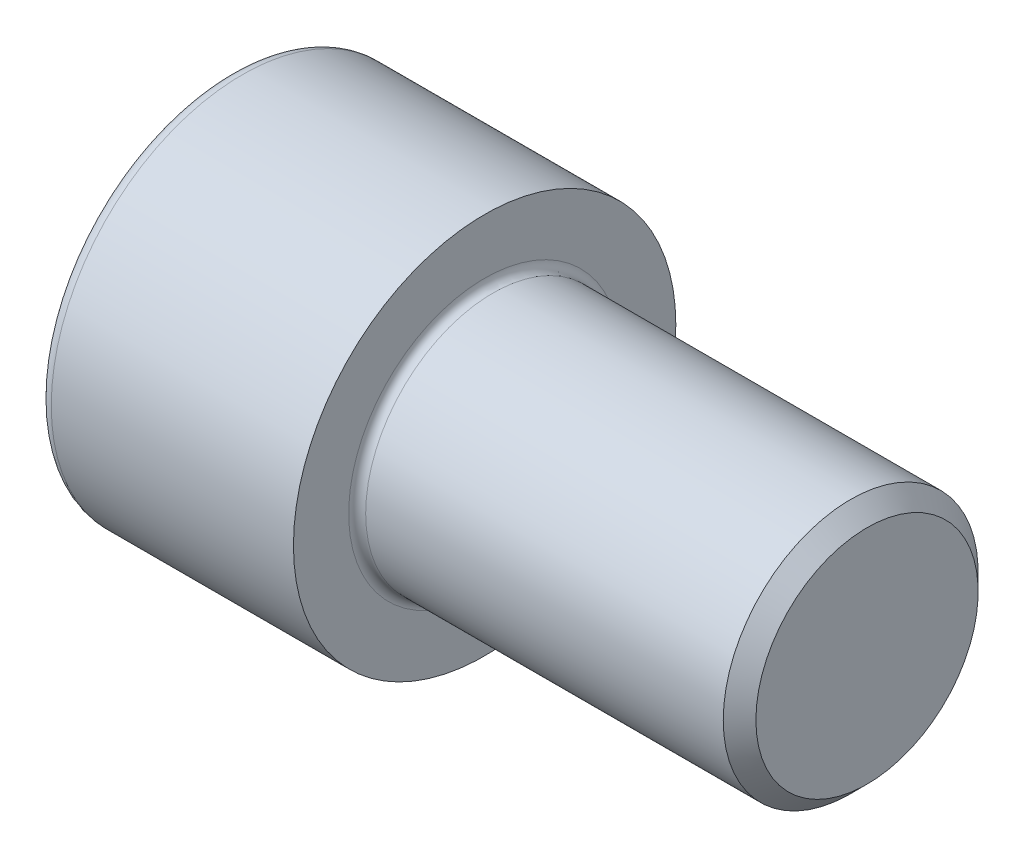
ISO-10303-21;
HEADER;
FILE_DESCRIPTION(('STEP AP214'),'2;1');
FILE_NAME('part.step','',(''),(''),'','','');
FILE_SCHEMA(('AUTOMOTIVE_DESIGN { 1 0 10303 214 1 1 1 1 }'));
ENDSEC;
DATA;
#1=APPLICATION_CONTEXT('core data for automotive mechanical design processes');
#2=APPLICATION_PROTOCOL_DEFINITION('international standard','automotive_design',2000,#1);
#3=PRODUCT_CONTEXT('',#1,'mechanical');
#4=PRODUCT('Part','Part','',(#3));
#5=PRODUCT_RELATED_PRODUCT_CATEGORY('part','',(#4));
#6=PRODUCT_DEFINITION_FORMATION('','',#4);
#7=PRODUCT_DEFINITION_CONTEXT('part definition',#1,'design');
#8=PRODUCT_DEFINITION('design','',#6,#7);
#9=PRODUCT_DEFINITION_SHAPE('','',#8);
#10=(LENGTH_UNIT() NAMED_UNIT(*) SI_UNIT(.MILLI.,.METRE.));
#11=(NAMED_UNIT(*) PLANE_ANGLE_UNIT() SI_UNIT($,.RADIAN.));
#12=(NAMED_UNIT(*) SI_UNIT($,.STERADIAN.) SOLID_ANGLE_UNIT());
#13=UNCERTAINTY_MEASURE_WITH_UNIT(LENGTH_MEASURE(1.E-05),#10,'distance_accuracy_value','');
#14=(GEOMETRIC_REPRESENTATION_CONTEXT(3) GLOBAL_UNCERTAINTY_ASSIGNED_CONTEXT((#13)) GLOBAL_UNIT_ASSIGNED_CONTEXT((#10,
#11,#12)) REPRESENTATION_CONTEXT('',''));
#15=CARTESIAN_POINT('',(0.,0.,0.));
#16=DIRECTION('',(0.,0.,1.));
#17=DIRECTION('',(1.,0.,0.));
#18=AXIS2_PLACEMENT_3D('',#15,#16,#17);
#19=CARTESIAN_POINT('',(0.,0.,0.));
#20=DIRECTION('',(-1.,0.,0.));
#21=DIRECTION('',(0.,0.,1.));
#22=AXIS2_PLACEMENT_3D('',#19,#20,#21);
#23=PLANE('',#22);
#24=DIRECTION('',(0.,-0.499999999999999,0.866025403784439));
#25=VECTOR('',#24,1.);
#26=CARTESIAN_POINT('',(0.,12.8604772461989,0.));
#27=LINE('',#26,#25);
#28=CARTESIAN_POINT('',(0.,12.8604772461989,0.));
#29=VERTEX_POINT('',#28);
#30=CARTESIAN_POINT('',(0.,6.43023862309947,11.1375));
#31=VERTEX_POINT('',#30);
#32=EDGE_CURVE('E259',#29,#31,#27,.T.);
#33=ORIENTED_EDGE('',*,*,#32,.T.);
#34=DIRECTION('',(0.,1.,0.));
#35=VECTOR('',#34,1.);
#36=CARTESIAN_POINT('',(0.,-6.43023862309945,11.1375));
#37=LINE('',#36,#35);
#38=CARTESIAN_POINT('',(0.,-6.43023862309945,11.1375));
#39=VERTEX_POINT('',#38);
#40=EDGE_CURVE('E131',#39,#31,#37,.T.);
#41=ORIENTED_EDGE('',*,*,#40,.F.);
#42=DIRECTION('',(0.,-0.500000000000001,-0.866025403784438));
#43=VECTOR('',#42,1.);
#44=CARTESIAN_POINT('',(0.,-6.43023862309945,11.1375));
#45=LINE('',#44,#43);
#46=CARTESIAN_POINT('',(0.,-12.8604772461989,0.));
#47=VERTEX_POINT('',#46);
#48=EDGE_CURVE('E262',#39,#47,#45,.T.);
#49=ORIENTED_EDGE('',*,*,#48,.T.);
#50=DIRECTION('',(0.,0.499999999999999,-0.866025403784439));
#51=VECTOR('',#50,1.);
#52=CARTESIAN_POINT('',(0.,-12.8604772461989,0.));
#53=LINE('',#52,#51);
#54=CARTESIAN_POINT('',(0.,-6.43023862309948,-11.1375));
#55=VERTEX_POINT('',#54);
#56=EDGE_CURVE('E265',#47,#55,#53,.T.);
#57=ORIENTED_EDGE('',*,*,#56,.T.);
#58=DIRECTION('',(0.,-1.,0.));
#59=VECTOR('',#58,1.);
#60=CARTESIAN_POINT('',(0.,6.43023862309944,-11.1375));
#61=LINE('',#60,#59);
#62=CARTESIAN_POINT('',(0.,6.43023862309944,-11.1375));
#63=VERTEX_POINT('',#62);
#64=EDGE_CURVE('E268',#63,#55,#61,.T.);
#65=ORIENTED_EDGE('',*,*,#64,.F.);
#66=DIRECTION('',(0.,-0.500000000000001,-0.866025403784438));
#67=VECTOR('',#66,1.);
#68=CARTESIAN_POINT('',(0.,12.8604772461989,0.));
#69=LINE('',#68,#67);
#70=EDGE_CURVE('E126',#29,#63,#69,.T.);
#71=ORIENTED_EDGE('',*,*,#70,.F.);
#72=EDGE_LOOP('',(#33,#41,#49,#57,#65,#71));
#73=FACE_BOUND('',#72,.T.);
#74=CARTESIAN_POINT('',(0.,0.,0.));
#75=DIRECTION('',(-1.,0.,0.));
#76=DIRECTION('',(0.,0.,1.));
#77=AXIS2_PLACEMENT_3D('',#74,#75,#76);
#78=CIRCLE('',#77,21.);
#79=CARTESIAN_POINT('',(0.,0.,21.));
#80=VERTEX_POINT('',#79);
#81=EDGE_CURVE('E43',#80,#80,#78,.T.);
#82=ORIENTED_EDGE('',*,*,#81,.T.);
#83=EDGE_LOOP('',(#82));
#84=FACE_BOUND('',#83,.T.);
#85=ADVANCED_FACE('F35',(#73,#84),#23,.T.);
#86=CARTESIAN_POINT('',(-31.75,0.,0.));
#87=DIRECTION('',(-1.,0.,0.));
#88=DIRECTION('',(0.,0.,1.));
#89=AXIS2_PLACEMENT_3D('',#86,#87,#88);
#90=CYLINDRICAL_SURFACE('',#89,22.5);
#91=CARTESIAN_POINT('',(1.5,0.,0.));
#92=DIRECTION('',(-1.,0.,0.));
#93=DIRECTION('',(0.,0.,1.));
#94=AXIS2_PLACEMENT_3D('',#91,#92,#93);
#95=CIRCLE('',#94,22.5);
#96=CARTESIAN_POINT('',(1.5,0.,22.5));
#97=VERTEX_POINT('',#96);
#98=EDGE_CURVE('E11',#97,#97,#95,.F.);
#99=ORIENTED_EDGE('',*,*,#98,.T.);
#100=EDGE_LOOP('',(#99));
#101=FACE_BOUND('',#100,.T.);
#102=CARTESIAN_POINT('',(30.,0.,0.));
#103=DIRECTION('',(-1.,0.,0.));
#104=DIRECTION('',(0.,0.,1.));
#105=AXIS2_PLACEMENT_3D('',#102,#103,#104);
#106=CIRCLE('',#105,22.5);
#107=CARTESIAN_POINT('',(30.,0.,22.5));
#108=VERTEX_POINT('',#107);
#109=EDGE_CURVE('E149',#108,#108,#106,.T.);
#110=ORIENTED_EDGE('',*,*,#109,.T.);
#111=EDGE_LOOP('',(#110));
#112=FACE_BOUND('',#111,.T.);
#113=ADVANCED_FACE('F173',(#101,#112),#90,.T.);
#114=CARTESIAN_POINT('',(30.,22.5,0.));
#115=DIRECTION('',(1.,0.,0.));
#116=DIRECTION('',(0.,0.,-1.));
#117=AXIS2_PLACEMENT_3D('',#114,#115,#116);
#118=PLANE('',#117);
#119=CARTESIAN_POINT('',(30.,0.,0.));
#120=DIRECTION('',(1.,0.,0.));
#121=DIRECTION('',(0.,0.,-1.));
#122=AXIS2_PLACEMENT_3D('',#119,#120,#121);
#123=CIRCLE('',#122,15.9999999999999);
#124=CARTESIAN_POINT('',(30.,0.,-15.9999999999999));
#125=VERTEX_POINT('',#124);
#126=EDGE_CURVE('E152',#125,#125,#123,.F.);
#127=ORIENTED_EDGE('',*,*,#126,.T.);
#128=EDGE_LOOP('',(#127));
#129=FACE_BOUND('',#128,.T.);
#130=ORIENTED_EDGE('',*,*,#109,.F.);
#131=EDGE_LOOP('',(#130));
#132=FACE_BOUND('',#131,.T.);
#133=ADVANCED_FACE('F179',(#129,#132),#118,.T.);
#134=CARTESIAN_POINT('',(-31.75,0.,0.));
#135=DIRECTION('',(-1.,0.,0.));
#136=DIRECTION('',(0.,0.,1.));
#137=AXIS2_PLACEMENT_3D('',#134,#135,#136);
#138=CYLINDRICAL_SURFACE('',#137,14.9999999999999);
#139=CARTESIAN_POINT('',(31.,0.,0.));
#140=DIRECTION('',(1.,0.,0.));
#141=DIRECTION('',(0.,0.,-1.));
#142=AXIS2_PLACEMENT_3D('',#139,#140,#141);
#143=CIRCLE('',#142,14.9999999999999);
#144=CARTESIAN_POINT('',(31.,0.,-14.9999999999999));
#145=VERTEX_POINT('',#144);
#146=EDGE_CURVE('E155',#145,#145,#143,.T.);
#147=ORIENTED_EDGE('',*,*,#146,.T.);
#148=EDGE_LOOP('',(#147));
#149=FACE_BOUND('',#148,.T.);
#150=CARTESIAN_POINT('',(73.0789999999998,0.,0.));
#151=DIRECTION('',(-1.,0.,0.));
#152=DIRECTION('',(0.,0.,1.));
#153=AXIS2_PLACEMENT_3D('',#150,#151,#152);
#154=CIRCLE('',#153,14.9999999999998);
#155=CARTESIAN_POINT('',(73.0789999999998,0.,14.9999999999998));
#156=VERTEX_POINT('',#155);
#157=EDGE_CURVE('E146',#156,#156,#154,.T.);
#158=ORIENTED_EDGE('',*,*,#157,.T.);
#159=EDGE_LOOP('',(#158));
#160=FACE_BOUND('',#159,.T.);
#161=ADVANCED_FACE('F185',(#149,#160),#138,.T.);
#162=CARTESIAN_POINT('',(75.,0.,0.));
#163=DIRECTION('',(-1.,0.,0.));
#164=DIRECTION('',(0.,0.,1.));
#165=AXIS2_PLACEMENT_3D('',#162,#163,#164);
#166=CONICAL_SURFACE('',#165,13.079,0.785398163397344);
#167=ORIENTED_EDGE('',*,*,#157,.F.);
#168=EDGE_LOOP('',(#167));
#169=FACE_BOUND('',#168,.T.);
#170=CARTESIAN_POINT('',(75.,0.,0.));
#171=DIRECTION('',(-1.,0.,0.));
#172=DIRECTION('',(0.,0.,1.));
#173=AXIS2_PLACEMENT_3D('',#170,#171,#172);
#174=CIRCLE('',#173,13.079);
#175=CARTESIAN_POINT('',(75.,0.,13.079));
#176=VERTEX_POINT('',#175);
#177=EDGE_CURVE('E142',#176,#176,#174,.T.);
#178=ORIENTED_EDGE('',*,*,#177,.T.);
#179=EDGE_LOOP('',(#178));
#180=FACE_BOUND('',#179,.T.);
#181=ADVANCED_FACE('F189',(#169,#180),#166,.T.);
#182=CARTESIAN_POINT('',(75.,13.079,0.));
#183=DIRECTION('',(1.,0.,0.));
#184=DIRECTION('',(0.,0.,-1.));
#185=AXIS2_PLACEMENT_3D('',#182,#183,#184);
#186=PLANE('',#185);
#187=ORIENTED_EDGE('',*,*,#177,.F.);
#188=EDGE_LOOP('',(#187));
#189=FACE_BOUND('',#188,.T.);
#190=ADVANCED_FACE('F169',(#189),#186,.T.);
#191=CARTESIAN_POINT('',(31.,0.,0.));
#192=DIRECTION('',(1.,0.,0.));
#193=DIRECTION('',(0.,0.,-1.));
#194=AXIS2_PLACEMENT_3D('',#191,#192,#193);
#195=TOROIDAL_SURFACE('',#194,15.9999999999999,1.);
#196=ORIENTED_EDGE('',*,*,#146,.F.);
#197=EDGE_LOOP('',(#196));
#198=FACE_BOUND('',#197,.T.);
#199=ORIENTED_EDGE('',*,*,#126,.F.);
#200=EDGE_LOOP('',(#199));
#201=FACE_BOUND('',#200,.T.);
#202=ADVANCED_FACE('F162',(#198,#201),#195,.F.);
#203=CARTESIAN_POINT('',(1.5,0.,0.));
#204=DIRECTION('',(-1.,0.,0.));
#205=DIRECTION('',(0.,0.,1.));
#206=AXIS2_PLACEMENT_3D('',#203,#204,#205);
#207=TOROIDAL_SURFACE('',#206,21.,1.5);
#208=ORIENTED_EDGE('',*,*,#98,.F.);
#209=EDGE_LOOP('',(#208));
#210=FACE_BOUND('',#209,.T.);
#211=ORIENTED_EDGE('',*,*,#81,.F.);
#212=EDGE_LOOP('',(#211));
#213=FACE_BOUND('',#212,.T.);
#214=ADVANCED_FACE('F37',(#210,#213),#207,.T.);
#215=CARTESIAN_POINT('',(15.5,12.8604772461989,0.));
#216=DIRECTION('',(0.,-0.866025403784439,-0.499999999999999));
#217=DIRECTION('',(0.,0.499999999999999,-0.866025403784439));
#218=AXIS2_PLACEMENT_3D('',#215,#216,#217);
#219=PLANE('',#218);
#220=ORIENTED_EDGE('',*,*,#32,.F.);
#221=DIRECTION('',(-1.,0.,0.));
#222=VECTOR('',#221,1.);
#223=CARTESIAN_POINT('',(15.5,12.8604772461989,0.));
#224=LINE('',#223,#222);
#225=CARTESIAN_POINT('',(15.5,12.8604772461989,0.));
#226=VERTEX_POINT('',#225);
#227=EDGE_CURVE('E249',#226,#29,#224,.T.);
#228=ORIENTED_EDGE('',*,*,#227,.F.);
#229=DIRECTION('',(0.,-0.499999999999999,0.866025403784439));
#230=VECTOR('',#229,1.);
#231=CARTESIAN_POINT('',(15.5,12.8604772461989,0.));
#232=LINE('',#231,#230);
#233=CARTESIAN_POINT('',(15.5,9.64535793464919,5.56874999999999));
#234=VERTEX_POINT('',#233);
#235=EDGE_CURVE('E118',#226,#234,#232,.T.);
#236=ORIENTED_EDGE('',*,*,#235,.T.);
#237=CARTESIAN_POINT('',(15.5,6.43023862309947,11.1375));
#238=VERTEX_POINT('',#237);
#239=EDGE_CURVE('E109',#234,#238,#232,.T.);
#240=ORIENTED_EDGE('',*,*,#239,.T.);
#241=DIRECTION('',(-1.,0.,0.));
#242=VECTOR('',#241,1.);
#243=CARTESIAN_POINT('',(15.5,6.43023862309947,11.1375));
#244=LINE('',#243,#242);
#245=EDGE_CURVE('E123',#238,#31,#244,.T.);
#246=ORIENTED_EDGE('',*,*,#245,.T.);
#247=EDGE_LOOP('',(#220,#228,#236,#240,#246));
#248=FACE_BOUND('',#247,.T.);
#249=ADVANCED_FACE('F122',(#248),#219,.T.);
#250=CARTESIAN_POINT('',(15.5,-6.43023862309945,11.1375));
#251=DIRECTION('',(0.,0.,1.));
#252=DIRECTION('',(0.,-1.,0.));
#253=AXIS2_PLACEMENT_3D('',#250,#251,#252);
#254=PLANE('',#253);
#255=ORIENTED_EDGE('',*,*,#40,.T.);
#256=ORIENTED_EDGE('',*,*,#245,.F.);
#257=DIRECTION('',(0.,1.,0.));
#258=VECTOR('',#257,1.);
#259=CARTESIAN_POINT('',(15.5,-6.43023862309945,11.1375));
#260=LINE('',#259,#258);
#261=CARTESIAN_POINT('',(15.5,0.,11.1375));
#262=VERTEX_POINT('',#261);
#263=EDGE_CURVE('E106',#262,#238,#260,.T.);
#264=ORIENTED_EDGE('',*,*,#263,.F.);
#265=CARTESIAN_POINT('',(15.5,-6.43023862309945,11.1375));
#266=VERTEX_POINT('',#265);
#267=EDGE_CURVE('E117',#266,#262,#260,.T.);
#268=ORIENTED_EDGE('',*,*,#267,.F.);
#269=DIRECTION('',(-1.,0.,0.));
#270=VECTOR('',#269,1.);
#271=CARTESIAN_POINT('',(15.5,-6.43023862309945,11.1375));
#272=LINE('',#271,#270);
#273=EDGE_CURVE('E133',#266,#39,#272,.T.);
#274=ORIENTED_EDGE('',*,*,#273,.T.);
#275=EDGE_LOOP('',(#255,#256,#264,#268,#274));
#276=FACE_BOUND('',#275,.T.);
#277=ADVANCED_FACE('F128',(#276),#254,.F.);
#278=CARTESIAN_POINT('',(15.5,-6.43023862309945,11.1375));
#279=DIRECTION('',(0.,0.866025403784438,-0.500000000000001));
#280=DIRECTION('',(0.,0.500000000000001,0.866025403784438));
#281=AXIS2_PLACEMENT_3D('',#278,#279,#280);
#282=PLANE('',#281);
#283=ORIENTED_EDGE('',*,*,#48,.F.);
#284=ORIENTED_EDGE('',*,*,#273,.F.);
#285=DIRECTION('',(0.,-0.500000000000001,-0.866025403784438));
#286=VECTOR('',#285,1.);
#287=CARTESIAN_POINT('',(15.5,-6.43023862309945,11.1375));
#288=LINE('',#287,#286);
#289=CARTESIAN_POINT('',(15.5,-9.64535793464918,5.56875000000001));
#290=VERTEX_POINT('',#289);
#291=EDGE_CURVE('E288',#266,#290,#288,.T.);
#292=ORIENTED_EDGE('',*,*,#291,.T.);
#293=CARTESIAN_POINT('',(15.5,-12.8604772461989,0.));
#294=VERTEX_POINT('',#293);
#295=EDGE_CURVE('E277',#290,#294,#288,.T.);
#296=ORIENTED_EDGE('',*,*,#295,.T.);
#297=DIRECTION('',(-1.,0.,0.));
#298=VECTOR('',#297,1.);
#299=CARTESIAN_POINT('',(15.5,-12.8604772461989,0.));
#300=LINE('',#299,#298);
#301=EDGE_CURVE('E138',#294,#47,#300,.T.);
#302=ORIENTED_EDGE('',*,*,#301,.T.);
#303=EDGE_LOOP('',(#283,#284,#292,#296,#302));
#304=FACE_BOUND('',#303,.T.);
#305=ADVANCED_FACE('F203',(#304),#282,.T.);
#306=CARTESIAN_POINT('',(15.5,-12.8604772461989,0.));
#307=DIRECTION('',(0.,0.866025403784439,0.499999999999999));
#308=DIRECTION('',(0.,-0.499999999999999,0.866025403784439));
#309=AXIS2_PLACEMENT_3D('',#306,#307,#308);
#310=PLANE('',#309);
#311=ORIENTED_EDGE('',*,*,#56,.F.);
#312=ORIENTED_EDGE('',*,*,#301,.F.);
#313=DIRECTION('',(0.,0.499999999999999,-0.866025403784439));
#314=VECTOR('',#313,1.);
#315=CARTESIAN_POINT('',(15.5,-12.8604772461989,0.));
#316=LINE('',#315,#314);
#317=CARTESIAN_POINT('',(15.5,-9.6453579346492,-5.56874999999999));
#318=VERTEX_POINT('',#317);
#319=EDGE_CURVE('E255',#294,#318,#316,.T.);
#320=ORIENTED_EDGE('',*,*,#319,.T.);
#321=CARTESIAN_POINT('',(15.5,-6.43023862309948,-11.1375));
#322=VERTEX_POINT('',#321);
#323=EDGE_CURVE('E287',#318,#322,#316,.T.);
#324=ORIENTED_EDGE('',*,*,#323,.T.);
#325=DIRECTION('',(-1.,0.,0.));
#326=VECTOR('',#325,1.);
#327=CARTESIAN_POINT('',(15.5,-6.43023862309948,-11.1375));
#328=LINE('',#327,#326);
#329=EDGE_CURVE('E248',#322,#55,#328,.T.);
#330=ORIENTED_EDGE('',*,*,#329,.T.);
#331=EDGE_LOOP('',(#311,#312,#320,#324,#330));
#332=FACE_BOUND('',#331,.T.);
#333=ADVANCED_FACE('F206',(#332),#310,.T.);
#334=CARTESIAN_POINT('',(15.5,6.43023862309944,-11.1375));
#335=DIRECTION('',(0.,0.,-1.));
#336=DIRECTION('',(0.,1.,0.));
#337=AXIS2_PLACEMENT_3D('',#334,#335,#336);
#338=PLANE('',#337);
#339=ORIENTED_EDGE('',*,*,#64,.T.);
#340=ORIENTED_EDGE('',*,*,#329,.F.);
#341=DIRECTION('',(0.,-1.,0.));
#342=VECTOR('',#341,1.);
#343=CARTESIAN_POINT('',(15.5,6.43023862309944,-11.1375));
#344=LINE('',#343,#342);
#345=CARTESIAN_POINT('',(15.5,0.,-11.1375));
#346=VERTEX_POINT('',#345);
#347=EDGE_CURVE('E252',#346,#322,#344,.T.);
#348=ORIENTED_EDGE('',*,*,#347,.F.);
#349=CARTESIAN_POINT('',(15.5,6.43023862309944,-11.1375));
#350=VERTEX_POINT('',#349);
#351=EDGE_CURVE('E50',#350,#346,#344,.T.);
#352=ORIENTED_EDGE('',*,*,#351,.F.);
#353=DIRECTION('',(-1.,0.,0.));
#354=VECTOR('',#353,1.);
#355=CARTESIAN_POINT('',(15.5,6.43023862309944,-11.1375));
#356=LINE('',#355,#354);
#357=EDGE_CURVE('E245',#350,#63,#356,.T.);
#358=ORIENTED_EDGE('',*,*,#357,.T.);
#359=EDGE_LOOP('',(#339,#340,#348,#352,#358));
#360=FACE_BOUND('',#359,.T.);
#361=ADVANCED_FACE('F210',(#360),#338,.F.);
#362=CARTESIAN_POINT('',(15.5,12.8604772461989,0.));
#363=DIRECTION('',(0.,0.866025403784438,-0.500000000000001));
#364=DIRECTION('',(0.,0.500000000000001,0.866025403784438));
#365=AXIS2_PLACEMENT_3D('',#362,#363,#364);
#366=PLANE('',#365);
#367=ORIENTED_EDGE('',*,*,#70,.T.);
#368=ORIENTED_EDGE('',*,*,#357,.F.);
#369=DIRECTION('',(0.,-0.500000000000001,-0.866025403784438));
#370=VECTOR('',#369,1.);
#371=CARTESIAN_POINT('',(15.5,12.8604772461989,0.));
#372=LINE('',#371,#370);
#373=CARTESIAN_POINT('',(15.5,9.64535793464917,-5.56875000000001));
#374=VERTEX_POINT('',#373);
#375=EDGE_CURVE('E235',#374,#350,#372,.T.);
#376=ORIENTED_EDGE('',*,*,#375,.F.);
#377=EDGE_CURVE('E241',#226,#374,#372,.T.);
#378=ORIENTED_EDGE('',*,*,#377,.F.);
#379=ORIENTED_EDGE('',*,*,#227,.T.);
#380=EDGE_LOOP('',(#367,#368,#376,#378,#379));
#381=FACE_BOUND('',#380,.T.);
#382=ADVANCED_FACE('F214',(#381),#366,.F.);
#383=CARTESIAN_POINT('',(15.5,12.8604772461989,0.));
#384=DIRECTION('',(1.,0.,0.));
#385=DIRECTION('',(0.,0.,-1.));
#386=AXIS2_PLACEMENT_3D('',#383,#384,#385);
#387=PLANE('',#386);
#388=ORIENTED_EDGE('',*,*,#347,.T.);
#389=ORIENTED_EDGE('',*,*,#323,.F.);
#390=CARTESIAN_POINT('',(15.5,0.,0.));
#391=DIRECTION('',(-1.,0.,0.));
#392=DIRECTION('',(0.,0.,1.));
#393=AXIS2_PLACEMENT_3D('',#390,#391,#392);
#394=CIRCLE('',#393,11.1375);
#395=EDGE_CURVE('E283',#346,#318,#394,.T.);
#396=ORIENTED_EDGE('',*,*,#395,.F.);
#397=EDGE_LOOP('',(#388,#389,#396));
#398=FACE_BOUND('',#397,.T.);
#399=ADVANCED_FACE('F218',(#398),#387,.F.);
#400=ORIENTED_EDGE('',*,*,#319,.F.);
#401=ORIENTED_EDGE('',*,*,#295,.F.);
#402=EDGE_CURVE('E136',#318,#290,#394,.T.);
#403=ORIENTED_EDGE('',*,*,#402,.F.);
#404=EDGE_LOOP('',(#400,#401,#403));
#405=FACE_BOUND('',#404,.T.);
#406=ADVANCED_FACE('F221',(#405),#387,.F.);
#407=ORIENTED_EDGE('',*,*,#291,.F.);
#408=ORIENTED_EDGE('',*,*,#267,.T.);
#409=EDGE_CURVE('E132',#290,#262,#394,.T.);
#410=ORIENTED_EDGE('',*,*,#409,.F.);
#411=EDGE_LOOP('',(#407,#408,#410));
#412=FACE_BOUND('',#411,.T.);
#413=ADVANCED_FACE('F226',(#412),#387,.F.);
#414=ORIENTED_EDGE('',*,*,#263,.T.);
#415=ORIENTED_EDGE('',*,*,#239,.F.);
#416=EDGE_CURVE('E112',#262,#234,#394,.T.);
#417=ORIENTED_EDGE('',*,*,#416,.F.);
#418=EDGE_LOOP('',(#414,#415,#417));
#419=FACE_BOUND('',#418,.T.);
#420=ADVANCED_FACE('F108',(#419),#387,.F.);
#421=ORIENTED_EDGE('',*,*,#235,.F.);
#422=ORIENTED_EDGE('',*,*,#377,.T.);
#423=EDGE_CURVE('E143',#234,#374,#394,.T.);
#424=ORIENTED_EDGE('',*,*,#423,.F.);
#425=EDGE_LOOP('',(#421,#422,#424));
#426=FACE_BOUND('',#425,.T.);
#427=ADVANCED_FACE('F229',(#426),#387,.F.);
#428=ORIENTED_EDGE('',*,*,#375,.T.);
#429=ORIENTED_EDGE('',*,*,#351,.T.);
#430=EDGE_CURVE('E238',#374,#346,#394,.T.);
#431=ORIENTED_EDGE('',*,*,#430,.F.);
#432=EDGE_LOOP('',(#428,#429,#431));
#433=FACE_BOUND('',#432,.T.);
#434=ADVANCED_FACE('F199',(#433),#387,.F.);
#435=CARTESIAN_POINT('',(15.5,0.,0.));
#436=DIRECTION('',(-1.,0.,0.));
#437=DIRECTION('',(0.,0.,1.));
#438=AXIS2_PLACEMENT_3D('',#435,#436,#437);
#439=CONICAL_SURFACE('',#438,11.1375,1.04719755119659);
#440=CARTESIAN_POINT('',(21.9302386230995,0.,0.));
#441=VERTEX_POINT('',#440);
#442=VERTEX_LOOP('',#441);
#443=FACE_BOUND('',#442,.T.);
#444=ORIENTED_EDGE('',*,*,#416,.T.);
#445=ORIENTED_EDGE('',*,*,#423,.T.);
#446=ORIENTED_EDGE('',*,*,#430,.T.);
#447=ORIENTED_EDGE('',*,*,#395,.T.);
#448=ORIENTED_EDGE('',*,*,#402,.T.);
#449=ORIENTED_EDGE('',*,*,#409,.T.);
#450=EDGE_LOOP('',(#444,#445,#446,#447,#448,#449));
#451=FACE_BOUND('',#450,.T.);
#452=ADVANCED_FACE('F197',(#443,#451),#439,.F.);
#453=CLOSED_SHELL('',(#85,#113,#133,#161,#181,#190,#202,#214,#249,#277,#305,#333,#361,#382,#399,
#406,#413,#420,#427,#434,#452));
#454=MANIFOLD_SOLID_BREP('B2',#453);
#455=ADVANCED_BREP_SHAPE_REPRESENTATION('',(#18,#454),#14);
#456=SHAPE_DEFINITION_REPRESENTATION(#9,#455);
ENDSEC;
END-ISO-10303-21;
